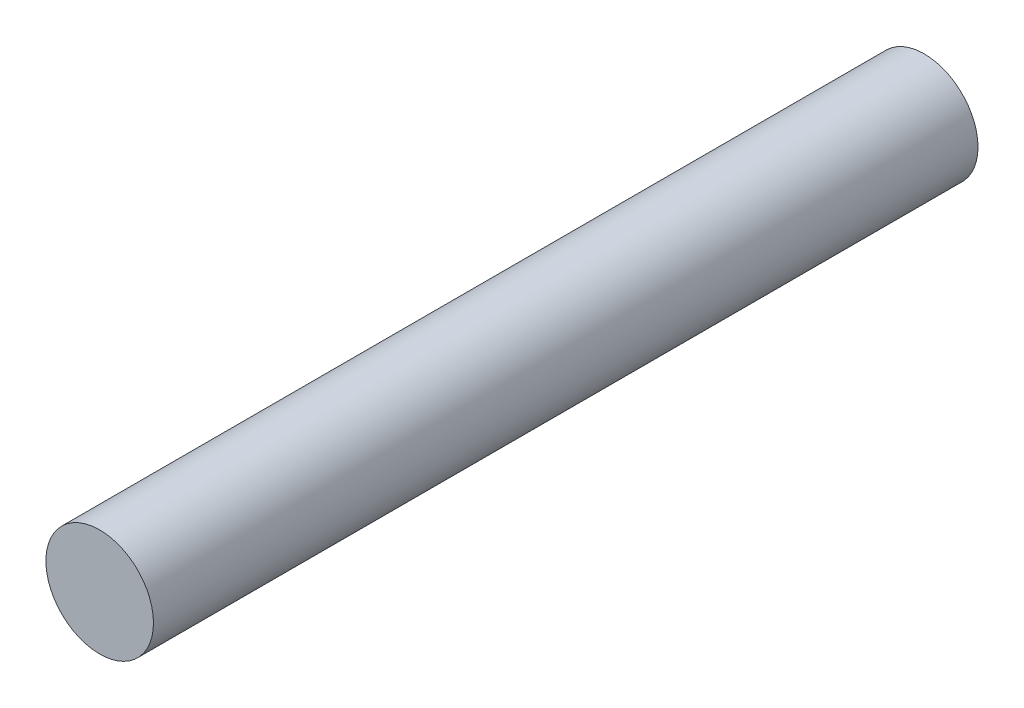
ISO-10303-21;
HEADER;
FILE_DESCRIPTION(('STEP AP214'),'2;1');
FILE_NAME('part.step','',(''),(''),'','','');
FILE_SCHEMA(('AUTOMOTIVE_DESIGN { 1 0 10303 214 1 1 1 1 }'));
ENDSEC;
DATA;
#1=APPLICATION_CONTEXT('core data for automotive mechanical design processes');
#2=APPLICATION_PROTOCOL_DEFINITION('international standard','automotive_design',2000,#1);
#3=PRODUCT_CONTEXT('',#1,'mechanical');
#4=PRODUCT('Part','Part','',(#3));
#5=PRODUCT_RELATED_PRODUCT_CATEGORY('part','',(#4));
#6=PRODUCT_DEFINITION_FORMATION('','',#4);
#7=PRODUCT_DEFINITION_CONTEXT('part definition',#1,'design');
#8=PRODUCT_DEFINITION('design','',#6,#7);
#9=PRODUCT_DEFINITION_SHAPE('','',#8);
#10=(LENGTH_UNIT() NAMED_UNIT(*) SI_UNIT(.MILLI.,.METRE.));
#11=(NAMED_UNIT(*) PLANE_ANGLE_UNIT() SI_UNIT($,.RADIAN.));
#12=(NAMED_UNIT(*) SI_UNIT($,.STERADIAN.) SOLID_ANGLE_UNIT());
#13=UNCERTAINTY_MEASURE_WITH_UNIT(LENGTH_MEASURE(1.E-05),#10,'distance_accuracy_value','');
#14=(GEOMETRIC_REPRESENTATION_CONTEXT(3) GLOBAL_UNCERTAINTY_ASSIGNED_CONTEXT((#13)) GLOBAL_UNIT_ASSIGNED_CONTEXT((#10,
#11,#12)) REPRESENTATION_CONTEXT('',''));
#15=CARTESIAN_POINT('',(0.,0.,0.));
#16=DIRECTION('',(0.,0.,1.));
#17=DIRECTION('',(1.,0.,0.));
#18=AXIS2_PLACEMENT_3D('',#15,#16,#17);
#19=CARTESIAN_POINT('',(0.,0.,92.));
#20=DIRECTION('',(0.,0.,-1.));
#21=DIRECTION('',(-1.,0.,0.));
#22=AXIS2_PLACEMENT_3D('',#19,#20,#21);
#23=CYLINDRICAL_SURFACE('',#22,6.);
#24=CARTESIAN_POINT('',(0.,0.,92.));
#25=DIRECTION('',(0.,0.,1.));
#26=DIRECTION('',(1.,0.,0.));
#27=AXIS2_PLACEMENT_3D('',#24,#25,#26);
#28=CIRCLE('',#27,6.);
#29=CARTESIAN_POINT('',(6.,0.,92.));
#30=VERTEX_POINT('',#29);
#31=EDGE_CURVE('E10',#30,#30,#28,.T.);
#32=ORIENTED_EDGE('',*,*,#31,.F.);
#33=EDGE_LOOP('',(#32));
#34=FACE_BOUND('',#33,.T.);
#35=CARTESIAN_POINT('',(0.,0.,0.));
#36=DIRECTION('',(0.,0.,1.));
#37=DIRECTION('',(1.,0.,0.));
#38=AXIS2_PLACEMENT_3D('',#35,#36,#37);
#39=CIRCLE('',#38,6.);
#40=CARTESIAN_POINT('',(6.,0.,0.));
#41=VERTEX_POINT('',#40);
#42=EDGE_CURVE('E38',#41,#41,#39,.T.);
#43=ORIENTED_EDGE('',*,*,#42,.T.);
#44=EDGE_LOOP('',(#43));
#45=FACE_BOUND('',#44,.T.);
#46=ADVANCED_FACE('F35',(#34,#45),#23,.T.);
#47=CARTESIAN_POINT('',(0.,0.,92.));
#48=DIRECTION('',(0.,0.,1.));
#49=DIRECTION('',(1.,0.,0.));
#50=AXIS2_PLACEMENT_3D('',#47,#48,#49);
#51=PLANE('',#50);
#52=ORIENTED_EDGE('',*,*,#31,.T.);
#53=EDGE_LOOP('',(#52));
#54=FACE_BOUND('',#53,.T.);
#55=ADVANCED_FACE('F50',(#54),#51,.T.);
#56=CARTESIAN_POINT('',(0.,0.,0.));
#57=DIRECTION('',(0.,0.,1.));
#58=DIRECTION('',(1.,0.,0.));
#59=AXIS2_PLACEMENT_3D('',#56,#57,#58);
#60=PLANE('',#59);
#61=ORIENTED_EDGE('',*,*,#42,.F.);
#62=EDGE_LOOP('',(#61));
#63=FACE_BOUND('',#62,.T.);
#64=ADVANCED_FACE('F48',(#63),#60,.F.);
#65=CLOSED_SHELL('',(#46,#55,#64));
#66=MANIFOLD_SOLID_BREP('B2',#65);
#67=ADVANCED_BREP_SHAPE_REPRESENTATION('',(#18,#66),#14);
#68=SHAPE_DEFINITION_REPRESENTATION(#9,#67);
ENDSEC;
END-ISO-10303-21;
